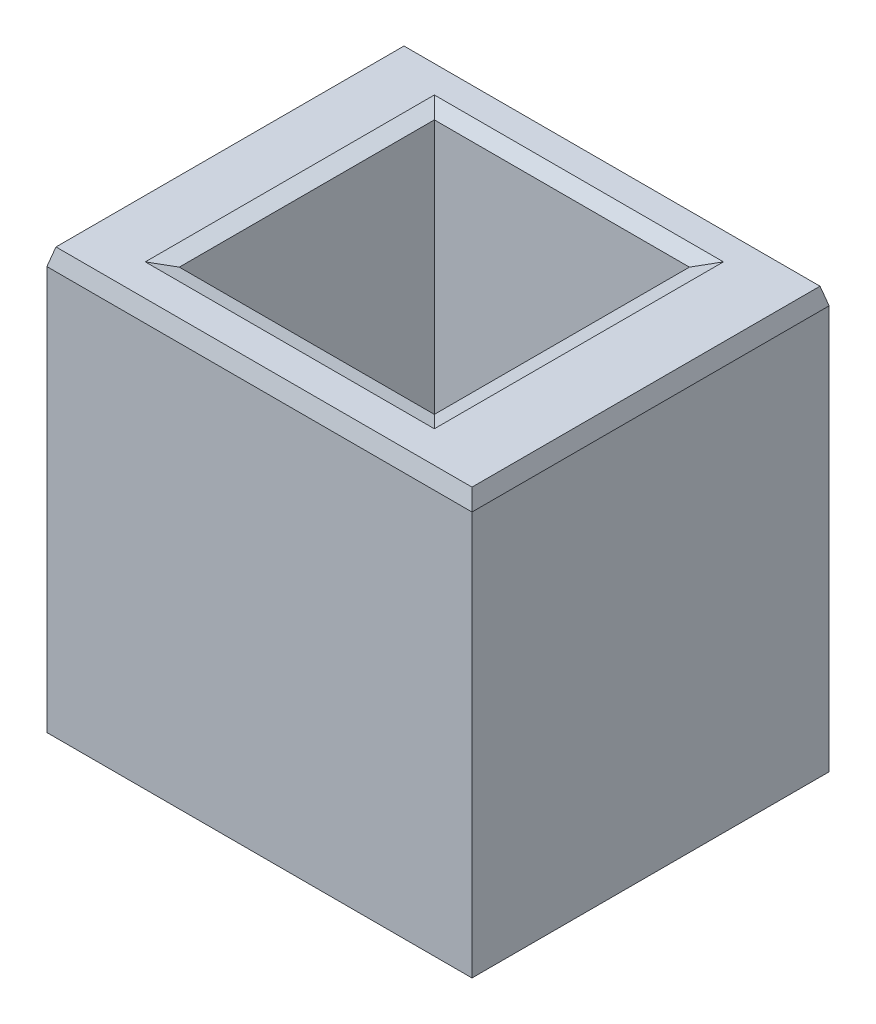
ISO-10303-21;
HEADER;
FILE_DESCRIPTION(('STEP AP214'),'2;1');
FILE_NAME('part.step','',(''),(''),'','','');
FILE_SCHEMA(('AUTOMOTIVE_DESIGN { 1 0 10303 214 1 1 1 1 }'));
ENDSEC;
DATA;
#1=APPLICATION_CONTEXT('core data for automotive mechanical design processes');
#2=APPLICATION_PROTOCOL_DEFINITION('international standard','automotive_design',2000,#1);
#3=PRODUCT_CONTEXT('',#1,'mechanical');
#4=PRODUCT('Part','Part','',(#3));
#5=PRODUCT_RELATED_PRODUCT_CATEGORY('part','',(#4));
#6=PRODUCT_DEFINITION_FORMATION('','',#4);
#7=PRODUCT_DEFINITION_CONTEXT('part definition',#1,'design');
#8=PRODUCT_DEFINITION('design','',#6,#7);
#9=PRODUCT_DEFINITION_SHAPE('','',#8);
#10=(LENGTH_UNIT() NAMED_UNIT(*) SI_UNIT(.MILLI.,.METRE.));
#11=(NAMED_UNIT(*) PLANE_ANGLE_UNIT() SI_UNIT($,.RADIAN.));
#12=(NAMED_UNIT(*) SI_UNIT($,.STERADIAN.) SOLID_ANGLE_UNIT());
#13=UNCERTAINTY_MEASURE_WITH_UNIT(LENGTH_MEASURE(1.E-05),#10,'distance_accuracy_value','');
#14=(GEOMETRIC_REPRESENTATION_CONTEXT(3) GLOBAL_UNCERTAINTY_ASSIGNED_CONTEXT((#13)) GLOBAL_UNIT_ASSIGNED_CONTEXT((#10,
#11,#12)) REPRESENTATION_CONTEXT('',''));
#15=CARTESIAN_POINT('',(0.,0.,0.));
#16=DIRECTION('',(0.,0.,1.));
#17=DIRECTION('',(1.,0.,0.));
#18=AXIS2_PLACEMENT_3D('',#15,#16,#17);
#19=CARTESIAN_POINT('',(0.,127.,0.));
#20=DIRECTION('',(0.,1.,0.));
#21=DIRECTION('',(0.,0.,1.));
#22=AXIS2_PLACEMENT_3D('',#19,#20,#21);
#23=PLANE('',#22);
#24=DIRECTION('',(-1.,0.,0.));
#25=VECTOR('',#24,1.);
#26=CARTESIAN_POINT('',(0.,127.,67.2868804878541));
#27=LINE('',#26,#25);
#28=CARTESIAN_POINT('',(46.7040091728361,127.,67.2868804878541));
#29=VERTEX_POINT('',#28);
#30=CARTESIAN_POINT('',(-39.6559908271641,127.,67.2868804878541));
#31=VERTEX_POINT('',#30);
#32=EDGE_CURVE('E48',#29,#31,#27,.T.);
#33=ORIENTED_EDGE('',*,*,#32,.T.);
#34=DIRECTION('',(0.,0.,-1.));
#35=VECTOR('',#34,1.);
#36=CARTESIAN_POINT('',(-39.6559908271641,127.,0.));
#37=LINE('',#36,#35);
#38=CARTESIAN_POINT('',(-39.6559908271641,127.,-19.073119512146));
#39=VERTEX_POINT('',#38);
#40=EDGE_CURVE('E11',#31,#39,#37,.T.);
#41=ORIENTED_EDGE('',*,*,#40,.T.);
#42=DIRECTION('',(1.,0.,0.));
#43=VECTOR('',#42,1.);
#44=CARTESIAN_POINT('',(0.,127.,-19.073119512146));
#45=LINE('',#44,#43);
#46=CARTESIAN_POINT('',(46.7040091728361,127.,-19.073119512146));
#47=VERTEX_POINT('',#46);
#48=EDGE_CURVE('E235',#39,#47,#45,.T.);
#49=ORIENTED_EDGE('',*,*,#48,.T.);
#50=DIRECTION('',(0.,0.,1.));
#51=VECTOR('',#50,1.);
#52=CARTESIAN_POINT('',(46.7040091728361,127.,0.));
#53=LINE('',#52,#51);
#54=EDGE_CURVE('E59',#47,#29,#53,.T.);
#55=ORIENTED_EDGE('',*,*,#54,.T.);
#56=EDGE_LOOP('',(#33,#41,#49,#55));
#57=FACE_BOUND('',#56,.T.);
#58=DIRECTION('',(0.,0.,-1.));
#59=VECTOR('',#58,1.);
#60=CARTESIAN_POINT('',(67.4192018977591,127.,-28.5682302771855));
#61=LINE('',#60,#59);
#62=CARTESIAN_POINT('',(67.4192018977591,127.,76.7614193817676));
#63=VERTEX_POINT('',#62);
#64=CARTESIAN_POINT('',(67.4192018977591,127.,-27.2070483796354));
#65=VERTEX_POINT('',#64);
#66=EDGE_CURVE('E230',#63,#65,#61,.T.);
#67=ORIENTED_EDGE('',*,*,#66,.T.);
#68=DIRECTION('',(-1.,0.,0.));
#69=VECTOR('',#68,1.);
#70=CARTESIAN_POINT('',(-58.2196162046908,127.,-27.2070483796354));
#71=LINE('',#70,#69);
#72=CARTESIAN_POINT('',(-56.8584343071407,127.,-27.2070483796354));
#73=VERTEX_POINT('',#72);
#74=EDGE_CURVE('E232',#65,#73,#71,.T.);
#75=ORIENTED_EDGE('',*,*,#74,.T.);
#76=DIRECTION('',(0.,0.,1.));
#77=VECTOR('',#76,1.);
#78=CARTESIAN_POINT('',(-56.8584343071407,127.,78.1226012793177));
#79=LINE('',#78,#77);
#80=CARTESIAN_POINT('',(-56.8584343071407,127.,76.7614193817676));
#81=VERTEX_POINT('',#80);
#82=EDGE_CURVE('E226',#73,#81,#79,.T.);
#83=ORIENTED_EDGE('',*,*,#82,.T.);
#84=DIRECTION('',(1.,0.,0.));
#85=VECTOR('',#84,1.);
#86=CARTESIAN_POINT('',(68.7803837953092,127.,76.7614193817676));
#87=LINE('',#86,#85);
#88=EDGE_CURVE('E228',#81,#63,#87,.T.);
#89=ORIENTED_EDGE('',*,*,#88,.T.);
#90=EDGE_LOOP('',(#67,#75,#83,#89));
#91=FACE_BOUND('',#90,.T.);
#92=ADVANCED_FACE('F38',(#57,#91),#23,.T.);
#93=CARTESIAN_POINT('',(0.,0.,0.));
#94=DIRECTION('',(0.,1.,0.));
#95=DIRECTION('',(0.,0.,1.));
#96=AXIS2_PLACEMENT_3D('',#93,#94,#95);
#97=PLANE('',#96);
#98=DIRECTION('',(0.,0.,1.));
#99=VECTOR('',#98,1.);
#100=CARTESIAN_POINT('',(-35.9371727247141,0.,62.2068804878541));
#101=LINE('',#100,#99);
#102=CARTESIAN_POINT('',(-35.9371727247141,0.,-15.3543014096961));
#103=VERTEX_POINT('',#102);
#104=CARTESIAN_POINT('',(-35.9371727247141,0.,63.5680623854042));
#105=VERTEX_POINT('',#104);
#106=EDGE_CURVE('E187',#103,#105,#101,.T.);
#107=ORIENTED_EDGE('',*,*,#106,.T.);
#108=DIRECTION('',(1.,0.,0.));
#109=VECTOR('',#108,1.);
#110=CARTESIAN_POINT('',(41.624009172836,0.,63.5680623854042));
#111=LINE('',#110,#109);
#112=CARTESIAN_POINT('',(42.9851910703861,0.,63.5680623854042));
#113=VERTEX_POINT('',#112);
#114=EDGE_CURVE('E189',#105,#113,#111,.T.);
#115=ORIENTED_EDGE('',*,*,#114,.T.);
#116=DIRECTION('',(0.,0.,-1.));
#117=VECTOR('',#116,1.);
#118=CARTESIAN_POINT('',(42.9851910703861,0.,-13.9931195121459));
#119=LINE('',#118,#117);
#120=CARTESIAN_POINT('',(42.9851910703861,0.,-15.3543014096961));
#121=VERTEX_POINT('',#120);
#122=EDGE_CURVE('E179',#113,#121,#119,.T.);
#123=ORIENTED_EDGE('',*,*,#122,.T.);
#124=DIRECTION('',(-1.,0.,0.));
#125=VECTOR('',#124,1.);
#126=CARTESIAN_POINT('',(-34.575990827164,0.,-15.3543014096961));
#127=LINE('',#126,#125);
#128=EDGE_CURVE('E181',#121,#103,#127,.T.);
#129=ORIENTED_EDGE('',*,*,#128,.T.);
#130=EDGE_LOOP('',(#107,#115,#123,#129));
#131=FACE_BOUND('',#130,.T.);
#132=DIRECTION('',(0.,0.,1.));
#133=VECTOR('',#132,1.);
#134=CARTESIAN_POINT('',(63.7003837953091,0.,0.));
#135=LINE('',#134,#133);
#136=CARTESIAN_POINT('',(63.7003837953091,0.,-23.4882302771854));
#137=VERTEX_POINT('',#136);
#138=CARTESIAN_POINT('',(63.7003837953091,0.,73.0426012793176));
#139=VERTEX_POINT('',#138);
#140=EDGE_CURVE('E178',#137,#139,#135,.T.);
#141=ORIENTED_EDGE('',*,*,#140,.T.);
#142=DIRECTION('',(-1.,0.,0.));
#143=VECTOR('',#142,1.);
#144=CARTESIAN_POINT('',(0.,0.,73.0426012793176));
#145=LINE('',#144,#143);
#146=CARTESIAN_POINT('',(-53.1396162046907,0.,73.0426012793176));
#147=VERTEX_POINT('',#146);
#148=EDGE_CURVE('E157',#139,#147,#145,.T.);
#149=ORIENTED_EDGE('',*,*,#148,.T.);
#150=DIRECTION('',(0.,0.,-1.));
#151=VECTOR('',#150,1.);
#152=CARTESIAN_POINT('',(-53.1396162046907,0.,0.));
#153=LINE('',#152,#151);
#154=CARTESIAN_POINT('',(-53.1396162046907,0.,-23.4882302771854));
#155=VERTEX_POINT('',#154);
#156=EDGE_CURVE('E167',#147,#155,#153,.T.);
#157=ORIENTED_EDGE('',*,*,#156,.T.);
#158=DIRECTION('',(1.,0.,0.));
#159=VECTOR('',#158,1.);
#160=CARTESIAN_POINT('',(0.,0.,-23.4882302771854));
#161=LINE('',#160,#159);
#162=EDGE_CURVE('E173',#155,#137,#161,.T.);
#163=ORIENTED_EDGE('',*,*,#162,.T.);
#164=EDGE_LOOP('',(#141,#149,#157,#163));
#165=FACE_BOUND('',#164,.T.);
#166=ADVANCED_FACE('F176',(#131,#165),#97,.F.);
#167=CARTESIAN_POINT('',(-58.2196162046908,127.,-28.5682302771855));
#168=DIRECTION('',(1.,0.,0.));
#169=DIRECTION('',(0.,0.,-1.));
#170=AXIS2_PLACEMENT_3D('',#167,#168,#169);
#171=PLANE('',#170);
#172=DIRECTION('',(0.,-1.,0.));
#173=VECTOR('',#172,1.);
#174=CARTESIAN_POINT('',(-58.2196162046908,127.,-28.5682302771855));
#175=LINE('',#174,#173);
#176=CARTESIAN_POINT('',(-58.2196162046908,121.92,-28.5682302771855));
#177=VERTEX_POINT('',#176);
#178=CARTESIAN_POINT('',(-58.2196162046908,1.36118189755011,-28.5682302771855));
#179=VERTEX_POINT('',#178);
#180=EDGE_CURVE('E310',#177,#179,#175,.T.);
#181=ORIENTED_EDGE('',*,*,#180,.T.);
#182=DIRECTION('',(0.,0.,1.));
#183=VECTOR('',#182,1.);
#184=CARTESIAN_POINT('',(-58.2196162046908,1.36118189755011,-28.5682302771855));
#185=LINE('',#184,#183);
#186=CARTESIAN_POINT('',(-58.2196162046908,1.36118189755011,78.1226012793177));
#187=VERTEX_POINT('',#186);
#188=EDGE_CURVE('E224',#179,#187,#185,.T.);
#189=ORIENTED_EDGE('',*,*,#188,.T.);
#190=DIRECTION('',(0.,-1.,0.));
#191=VECTOR('',#190,1.);
#192=CARTESIAN_POINT('',(-58.2196162046908,127.,78.1226012793177));
#193=LINE('',#192,#191);
#194=CARTESIAN_POINT('',(-58.2196162046908,121.92,78.1226012793177));
#195=VERTEX_POINT('',#194);
#196=EDGE_CURVE('E174',#195,#187,#193,.T.);
#197=ORIENTED_EDGE('',*,*,#196,.F.);
#198=DIRECTION('',(0.,0.,-1.));
#199=VECTOR('',#198,1.);
#200=CARTESIAN_POINT('',(-58.2196162046908,121.92,-28.5682302771855));
#201=LINE('',#200,#199);
#202=EDGE_CURVE('E222',#195,#177,#201,.T.);
#203=ORIENTED_EDGE('',*,*,#202,.T.);
#204=EDGE_LOOP('',(#181,#189,#197,#203));
#205=FACE_BOUND('',#204,.T.);
#206=ADVANCED_FACE('F292',(#205),#171,.F.);
#207=CARTESIAN_POINT('',(-58.2196162046908,127.,78.1226012793177));
#208=DIRECTION('',(0.,0.,-1.));
#209=DIRECTION('',(-1.,0.,0.));
#210=AXIS2_PLACEMENT_3D('',#207,#208,#209);
#211=PLANE('',#210);
#212=ORIENTED_EDGE('',*,*,#196,.T.);
#213=DIRECTION('',(1.,0.,0.));
#214=VECTOR('',#213,1.);
#215=CARTESIAN_POINT('',(-58.2196162046908,1.36118189755011,78.1226012793177));
#216=LINE('',#215,#214);
#217=CARTESIAN_POINT('',(68.7803837953092,1.36118189755011,78.1226012793177));
#218=VERTEX_POINT('',#217);
#219=EDGE_CURVE('E160',#187,#218,#216,.T.);
#220=ORIENTED_EDGE('',*,*,#219,.T.);
#221=DIRECTION('',(0.,-1.,0.));
#222=VECTOR('',#221,1.);
#223=CARTESIAN_POINT('',(68.7803837953092,127.,78.1226012793177));
#224=LINE('',#223,#222);
#225=CARTESIAN_POINT('',(68.7803837953092,121.92,78.1226012793177));
#226=VERTEX_POINT('',#225);
#227=EDGE_CURVE('E289',#226,#218,#224,.T.);
#228=ORIENTED_EDGE('',*,*,#227,.F.);
#229=DIRECTION('',(-1.,0.,0.));
#230=VECTOR('',#229,1.);
#231=CARTESIAN_POINT('',(-58.2196162046908,121.92,78.1226012793177));
#232=LINE('',#231,#230);
#233=EDGE_CURVE('E210',#226,#195,#232,.T.);
#234=ORIENTED_EDGE('',*,*,#233,.T.);
#235=EDGE_LOOP('',(#212,#220,#228,#234));
#236=FACE_BOUND('',#235,.T.);
#237=ADVANCED_FACE('F287',(#236),#211,.F.);
#238=CARTESIAN_POINT('',(68.7803837953092,127.,-28.5682302771855));
#239=DIRECTION('',(-1.,0.,0.));
#240=DIRECTION('',(0.,0.,1.));
#241=AXIS2_PLACEMENT_3D('',#238,#239,#240);
#242=PLANE('',#241);
#243=ORIENTED_EDGE('',*,*,#227,.T.);
#244=DIRECTION('',(0.,0.,-1.));
#245=VECTOR('',#244,1.);
#246=CARTESIAN_POINT('',(68.7803837953092,1.36118189755011,-28.5682302771855));
#247=LINE('',#246,#245);
#248=CARTESIAN_POINT('',(68.7803837953092,1.36118189755011,-28.5682302771855));
#249=VERTEX_POINT('',#248);
#250=EDGE_CURVE('E215',#218,#249,#247,.T.);
#251=ORIENTED_EDGE('',*,*,#250,.T.);
#252=DIRECTION('',(0.,-1.,0.));
#253=VECTOR('',#252,1.);
#254=CARTESIAN_POINT('',(68.7803837953092,127.,-28.5682302771855));
#255=LINE('',#254,#253);
#256=CARTESIAN_POINT('',(68.7803837953092,121.92,-28.5682302771855));
#257=VERTEX_POINT('',#256);
#258=EDGE_CURVE('E295',#257,#249,#255,.T.);
#259=ORIENTED_EDGE('',*,*,#258,.F.);
#260=DIRECTION('',(0.,0.,1.));
#261=VECTOR('',#260,1.);
#262=CARTESIAN_POINT('',(68.7803837953092,121.92,78.1226012793177));
#263=LINE('',#262,#261);
#264=EDGE_CURVE('E213',#257,#226,#263,.T.);
#265=ORIENTED_EDGE('',*,*,#264,.T.);
#266=EDGE_LOOP('',(#243,#251,#259,#265));
#267=FACE_BOUND('',#266,.T.);
#268=ADVANCED_FACE('F308',(#267),#242,.F.);
#269=CARTESIAN_POINT('',(-58.2196162046908,127.,-28.5682302771855));
#270=DIRECTION('',(0.,0.,1.));
#271=DIRECTION('',(1.,0.,0.));
#272=AXIS2_PLACEMENT_3D('',#269,#270,#271);
#273=PLANE('',#272);
#274=ORIENTED_EDGE('',*,*,#258,.T.);
#275=DIRECTION('',(-1.,0.,0.));
#276=VECTOR('',#275,1.);
#277=CARTESIAN_POINT('',(-58.2196162046908,1.36118189755011,-28.5682302771855));
#278=LINE('',#277,#276);
#279=EDGE_CURVE('E220',#249,#179,#278,.T.);
#280=ORIENTED_EDGE('',*,*,#279,.T.);
#281=ORIENTED_EDGE('',*,*,#180,.F.);
#282=DIRECTION('',(1.,0.,0.));
#283=VECTOR('',#282,1.);
#284=CARTESIAN_POINT('',(68.7803837953092,121.92,-28.5682302771855));
#285=LINE('',#284,#283);
#286=EDGE_CURVE('E217',#177,#257,#285,.T.);
#287=ORIENTED_EDGE('',*,*,#286,.T.);
#288=EDGE_LOOP('',(#274,#280,#281,#287));
#289=FACE_BOUND('',#288,.T.);
#290=ADVANCED_FACE('F380',(#289),#273,.F.);
#291=CARTESIAN_POINT('',(41.624009172836,127.,-13.9931195121459));
#292=DIRECTION('',(-1.,0.,0.));
#293=DIRECTION('',(0.,0.,1.));
#294=AXIS2_PLACEMENT_3D('',#291,#292,#293);
#295=PLANE('',#294);
#296=DIRECTION('',(0.,-1.,0.));
#297=VECTOR('',#296,1.);
#298=CARTESIAN_POINT('',(41.624009172836,127.,-13.9931195121459));
#299=LINE('',#298,#297);
#300=CARTESIAN_POINT('',(41.624009172836,125.63881810245,-13.9931195121459));
#301=VERTEX_POINT('',#300);
#302=CARTESIAN_POINT('',(41.624009172836,5.08000000000008,-13.9931195121459));
#303=VERTEX_POINT('',#302);
#304=EDGE_CURVE('E311',#301,#303,#299,.T.);
#305=ORIENTED_EDGE('',*,*,#304,.T.);
#306=DIRECTION('',(0.,0.,1.));
#307=VECTOR('',#306,1.);
#308=CARTESIAN_POINT('',(41.624009172836,5.08000000000008,62.2068804878541));
#309=LINE('',#308,#307);
#310=CARTESIAN_POINT('',(41.624009172836,5.08000000000008,62.2068804878541));
#311=VERTEX_POINT('',#310);
#312=EDGE_CURVE('E208',#303,#311,#309,.T.);
#313=ORIENTED_EDGE('',*,*,#312,.T.);
#314=DIRECTION('',(0.,-1.,0.));
#315=VECTOR('',#314,1.);
#316=CARTESIAN_POINT('',(41.624009172836,127.,62.2068804878541));
#317=LINE('',#316,#315);
#318=CARTESIAN_POINT('',(41.624009172836,125.63881810245,62.2068804878541));
#319=VERTEX_POINT('',#318);
#320=EDGE_CURVE('E249',#319,#311,#317,.T.);
#321=ORIENTED_EDGE('',*,*,#320,.F.);
#322=DIRECTION('',(0.,0.,-1.));
#323=VECTOR('',#322,1.);
#324=CARTESIAN_POINT('',(41.624009172836,125.63881810245,-13.9931195121459));
#325=LINE('',#324,#323);
#326=EDGE_CURVE('E206',#319,#301,#325,.T.);
#327=ORIENTED_EDGE('',*,*,#326,.T.);
#328=EDGE_LOOP('',(#305,#313,#321,#327));
#329=FACE_BOUND('',#328,.T.);
#330=ADVANCED_FACE('F377',(#329),#295,.T.);
#331=CARTESIAN_POINT('',(-34.575990827164,127.,-13.9931195121459));
#332=DIRECTION('',(0.,0.,1.));
#333=DIRECTION('',(1.,0.,0.));
#334=AXIS2_PLACEMENT_3D('',#331,#332,#333);
#335=PLANE('',#334);
#336=DIRECTION('',(0.,-1.,0.));
#337=VECTOR('',#336,1.);
#338=CARTESIAN_POINT('',(-34.575990827164,127.,-13.9931195121459));
#339=LINE('',#338,#337);
#340=CARTESIAN_POINT('',(-34.575990827164,125.63881810245,-13.9931195121459));
#341=VERTEX_POINT('',#340);
#342=CARTESIAN_POINT('',(-34.575990827164,5.08000000000008,-13.9931195121459));
#343=VERTEX_POINT('',#342);
#344=EDGE_CURVE('E316',#341,#343,#339,.T.);
#345=ORIENTED_EDGE('',*,*,#344,.T.);
#346=DIRECTION('',(1.,0.,0.));
#347=VECTOR('',#346,1.);
#348=CARTESIAN_POINT('',(41.624009172836,5.08000000000008,-13.9931195121459));
#349=LINE('',#348,#347);
#350=EDGE_CURVE('E204',#343,#303,#349,.T.);
#351=ORIENTED_EDGE('',*,*,#350,.T.);
#352=ORIENTED_EDGE('',*,*,#304,.F.);
#353=DIRECTION('',(-1.,0.,0.));
#354=VECTOR('',#353,1.);
#355=CARTESIAN_POINT('',(-34.575990827164,125.63881810245,-13.9931195121459));
#356=LINE('',#355,#354);
#357=EDGE_CURVE('E202',#301,#341,#356,.T.);
#358=ORIENTED_EDGE('',*,*,#357,.T.);
#359=EDGE_LOOP('',(#345,#351,#352,#358));
#360=FACE_BOUND('',#359,.T.);
#361=ADVANCED_FACE('F354',(#360),#335,.T.);
#362=CARTESIAN_POINT('',(-34.575990827164,127.,-13.9931195121459));
#363=DIRECTION('',(1.,0.,0.));
#364=DIRECTION('',(0.,0.,-1.));
#365=AXIS2_PLACEMENT_3D('',#362,#363,#364);
#366=PLANE('',#365);
#367=DIRECTION('',(0.,-1.,0.));
#368=VECTOR('',#367,1.);
#369=CARTESIAN_POINT('',(-34.575990827164,127.,62.2068804878541));
#370=LINE('',#369,#368);
#371=CARTESIAN_POINT('',(-34.575990827164,125.63881810245,62.2068804878541));
#372=VERTEX_POINT('',#371);
#373=CARTESIAN_POINT('',(-34.575990827164,5.08000000000008,62.2068804878541));
#374=VERTEX_POINT('',#373);
#375=EDGE_CURVE('E319',#372,#374,#370,.T.);
#376=ORIENTED_EDGE('',*,*,#375,.T.);
#377=DIRECTION('',(0.,0.,-1.));
#378=VECTOR('',#377,1.);
#379=CARTESIAN_POINT('',(-34.575990827164,5.08000000000008,-13.9931195121459));
#380=LINE('',#379,#378);
#381=EDGE_CURVE('E200',#374,#343,#380,.T.);
#382=ORIENTED_EDGE('',*,*,#381,.T.);
#383=ORIENTED_EDGE('',*,*,#344,.F.);
#384=DIRECTION('',(0.,0.,1.));
#385=VECTOR('',#384,1.);
#386=CARTESIAN_POINT('',(-34.575990827164,125.63881810245,-13.9931195121459));
#387=LINE('',#386,#385);
#388=EDGE_CURVE('E197',#341,#372,#387,.T.);
#389=ORIENTED_EDGE('',*,*,#388,.T.);
#390=EDGE_LOOP('',(#376,#382,#383,#389));
#391=FACE_BOUND('',#390,.T.);
#392=ADVANCED_FACE('F350',(#391),#366,.T.);
#393=CARTESIAN_POINT('',(-34.575990827164,127.,62.2068804878541));
#394=DIRECTION('',(0.,0.,-1.));
#395=DIRECTION('',(-1.,0.,0.));
#396=AXIS2_PLACEMENT_3D('',#393,#394,#395);
#397=PLANE('',#396);
#398=ORIENTED_EDGE('',*,*,#320,.T.);
#399=DIRECTION('',(-1.,0.,0.));
#400=VECTOR('',#399,1.);
#401=CARTESIAN_POINT('',(-34.575990827164,5.08000000000008,62.2068804878541));
#402=LINE('',#401,#400);
#403=EDGE_CURVE('E194',#311,#374,#402,.T.);
#404=ORIENTED_EDGE('',*,*,#403,.T.);
#405=ORIENTED_EDGE('',*,*,#375,.F.);
#406=DIRECTION('',(1.,0.,0.));
#407=VECTOR('',#406,1.);
#408=CARTESIAN_POINT('',(-34.575990827164,125.63881810245,62.2068804878541));
#409=LINE('',#408,#407);
#410=EDGE_CURVE('E192',#372,#319,#409,.T.);
#411=ORIENTED_EDGE('',*,*,#410,.T.);
#412=EDGE_LOOP('',(#398,#404,#405,#411));
#413=FACE_BOUND('',#412,.T.);
#414=ADVANCED_FACE('F326',(#413),#397,.T.);
#415=CARTESIAN_POINT('',(0.,0.,-15.3543014096961));
#416=DIRECTION('',(0.,-0.258819045102517,0.965925826289069));
#417=DIRECTION('',(1.,0.,0.));
#418=AXIS2_PLACEMENT_3D('',#415,#416,#417);
#419=PLANE('',#418);
#420=DIRECTION('',(0.250562807085728,-0.935113126531031,-0.250562807085728));
#421=VECTOR('',#420,1.);
#422=CARTESIAN_POINT('',(40.2865068277918,10.0716267069478,-12.6556171671017));
#423=LINE('',#422,#421);
#424=EDGE_CURVE('E243',#303,#121,#423,.T.);
#425=ORIENTED_EDGE('',*,*,#424,.F.);
#426=ORIENTED_EDGE('',*,*,#350,.F.);
#427=DIRECTION('',(-0.250562807085728,-0.935113126531031,-0.250562807085729));
#428=VECTOR('',#427,1.);
#429=CARTESIAN_POINT('',(-34.9732032682903,3.59758298831804,-14.3903319532723));
#430=LINE('',#429,#428);
#431=EDGE_CURVE('E246',#103,#343,#430,.F.);
#432=ORIENTED_EDGE('',*,*,#431,.F.);
#433=ORIENTED_EDGE('',*,*,#128,.F.);
#434=EDGE_LOOP('',(#425,#426,#432,#433));
#435=FACE_BOUND('',#434,.T.);
#436=ADVANCED_FACE('F358',(#435),#419,.T.);
#437=CARTESIAN_POINT('',(-35.9371727247141,0.,0.));
#438=DIRECTION('',(0.96592582628907,-0.258819045102516,0.));
#439=DIRECTION('',(0.,0.,-1.));
#440=AXIS2_PLACEMENT_3D('',#437,#438,#439);
#441=PLANE('',#440);
#442=ORIENTED_EDGE('',*,*,#431,.T.);
#443=ORIENTED_EDGE('',*,*,#381,.F.);
#444=DIRECTION('',(-0.250562807085727,-0.935113126531031,0.250562807085729));
#445=VECTOR('',#444,1.);
#446=CARTESIAN_POINT('',(-33.6809751985295,8.42024379963224,61.3118648592196));
#447=LINE('',#446,#445);
#448=EDGE_CURVE('E241',#105,#374,#447,.F.);
#449=ORIENTED_EDGE('',*,*,#448,.F.);
#450=ORIENTED_EDGE('',*,*,#106,.F.);
#451=EDGE_LOOP('',(#442,#443,#449,#450));
#452=FACE_BOUND('',#451,.T.);
#453=ADVANCED_FACE('F347',(#452),#441,.T.);
#454=CARTESIAN_POINT('',(42.9851910703861,0.,0.));
#455=DIRECTION('',(-0.965925826289069,-0.258819045102517,0.));
#456=DIRECTION('',(0.,0.,1.));
#457=AXIS2_PLACEMENT_3D('',#454,#455,#456);
#458=PLANE('',#457);
#459=ORIENTED_EDGE('',*,*,#424,.T.);
#460=ORIENTED_EDGE('',*,*,#122,.F.);
#461=DIRECTION('',(-0.250562807085728,0.935113126531031,-0.250562807085728));
#462=VECTOR('',#461,1.);
#463=CARTESIAN_POINT('',(40.2865068277918,10.0716267069478,60.8693781428098));
#464=LINE('',#463,#462);
#465=EDGE_CURVE('E239',#311,#113,#464,.F.);
#466=ORIENTED_EDGE('',*,*,#465,.F.);
#467=ORIENTED_EDGE('',*,*,#312,.F.);
#468=EDGE_LOOP('',(#459,#460,#466,#467));
#469=FACE_BOUND('',#468,.T.);
#470=ADVANCED_FACE('F340',(#469),#458,.T.);
#471=CARTESIAN_POINT('',(0.,0.,63.5680623854042));
#472=DIRECTION('',(0.,-0.258819045102517,-0.965925826289069));
#473=DIRECTION('',(-1.,0.,0.));
#474=AXIS2_PLACEMENT_3D('',#471,#472,#473);
#475=PLANE('',#474);
#476=ORIENTED_EDGE('',*,*,#448,.T.);
#477=ORIENTED_EDGE('',*,*,#403,.F.);
#478=ORIENTED_EDGE('',*,*,#465,.T.);
#479=ORIENTED_EDGE('',*,*,#114,.F.);
#480=EDGE_LOOP('',(#476,#477,#478,#479));
#481=FACE_BOUND('',#480,.T.);
#482=ADVANCED_FACE('F333',(#481),#475,.T.);
#483=CARTESIAN_POINT('',(-58.2196162046908,1.36118189755011,-28.5682302771855));
#484=DIRECTION('',(0.,0.965925826289069,0.258819045102517));
#485=DIRECTION('',(-1.,0.,0.));
#486=AXIS2_PLACEMENT_3D('',#483,#484,#485);
#487=PLANE('',#486);
#488=DIRECTION('',(-0.694746590606866,-0.186156787897383,0.694746590606866));
#489=VECTOR('',#488,1.);
#490=CARTESIAN_POINT('',(7.48093500000641,-15.063955903624,32.7312185181173));
#491=LINE('',#490,#489);
#492=EDGE_CURVE('E163',#137,#249,#491,.F.);
#493=ORIENTED_EDGE('',*,*,#492,.F.);
#494=ORIENTED_EDGE('',*,*,#162,.F.);
#495=DIRECTION('',(0.694746590606866,-0.186156787897383,0.694746590606866));
#496=VECTOR('',#495,1.);
#497=CARTESIAN_POINT('',(-58.2196162046908,1.36118189755011,-28.5682302771855));
#498=LINE('',#497,#496);
#499=EDGE_CURVE('E170',#179,#155,#498,.T.);
#500=ORIENTED_EDGE('',*,*,#499,.F.);
#501=ORIENTED_EDGE('',*,*,#279,.F.);
#502=EDGE_LOOP('',(#493,#494,#500,#501));
#503=FACE_BOUND('',#502,.T.);
#504=ADVANCED_FACE('F301',(#503),#487,.F.);
#505=CARTESIAN_POINT('',(-58.2196162046908,1.36118189755011,-28.5682302771855));
#506=DIRECTION('',(0.258819045102517,0.965925826289069,0.));
#507=DIRECTION('',(0.,0.,1.));
#508=AXIS2_PLACEMENT_3D('',#505,#506,#507);
#509=PLANE('',#508);
#510=ORIENTED_EDGE('',*,*,#499,.T.);
#511=ORIENTED_EDGE('',*,*,#156,.F.);
#512=DIRECTION('',(-0.694746590606866,0.186156787897383,0.694746590606866));
#513=VECTOR('',#512,1.);
#514=CARTESIAN_POINT('',(-6.72285111865822,-12.4373347200674,26.6258361932851));
#515=LINE('',#514,#513);
#516=EDGE_CURVE('E153',#187,#147,#515,.F.);
#517=ORIENTED_EDGE('',*,*,#516,.F.);
#518=ORIENTED_EDGE('',*,*,#188,.F.);
#519=EDGE_LOOP('',(#510,#511,#517,#518));
#520=FACE_BOUND('',#519,.T.);
#521=ADVANCED_FACE('F168',(#520),#509,.F.);
#522=CARTESIAN_POINT('',(68.7803837953092,1.36118189755011,-28.5682302771855));
#523=DIRECTION('',(-0.258819045102517,0.965925826289069,0.));
#524=DIRECTION('',(0.,0.,-1.));
#525=AXIS2_PLACEMENT_3D('',#522,#523,#524);
#526=PLANE('',#525);
#527=ORIENTED_EDGE('',*,*,#492,.T.);
#528=ORIENTED_EDGE('',*,*,#250,.F.);
#529=DIRECTION('',(-0.694746590606866,-0.186156787897383,-0.694746590606866));
#530=VECTOR('',#529,1.);
#531=CARTESIAN_POINT('',(17.2836187092766,-12.4373347200674,26.6258361932851));
#532=LINE('',#531,#530);
#533=EDGE_CURVE('E164',#139,#218,#532,.F.);
#534=ORIENTED_EDGE('',*,*,#533,.F.);
#535=ORIENTED_EDGE('',*,*,#140,.F.);
#536=EDGE_LOOP('',(#527,#528,#534,#535));
#537=FACE_BOUND('',#536,.T.);
#538=ADVANCED_FACE('F304',(#537),#526,.F.);
#539=CARTESIAN_POINT('',(-58.2196162046908,1.36118189755011,78.1226012793177));
#540=DIRECTION('',(0.,0.965925826289069,-0.258819045102517));
#541=DIRECTION('',(1.,0.,0.));
#542=AXIS2_PLACEMENT_3D('',#539,#540,#541);
#543=PLANE('',#542);
#544=ORIENTED_EDGE('',*,*,#516,.T.);
#545=ORIENTED_EDGE('',*,*,#148,.F.);
#546=ORIENTED_EDGE('',*,*,#533,.T.);
#547=ORIENTED_EDGE('',*,*,#219,.F.);
#548=EDGE_LOOP('',(#544,#545,#546,#547));
#549=FACE_BOUND('',#548,.T.);
#550=ADVANCED_FACE('F155',(#549),#543,.F.);
#551=CARTESIAN_POINT('',(41.624009172836,125.63881810245,-13.9931195121459));
#552=DIRECTION('',(0.258819045102517,-0.965925826289069,0.));
#553=DIRECTION('',(0.,0.,-1.));
#554=AXIS2_PLACEMENT_3D('',#551,#552,#553);
#555=PLANE('',#554);
#556=DIRECTION('',(0.694746590606866,0.186156787897383,0.694746590606866));
#557=VECTOR('',#556,1.);
#558=CARTESIAN_POINT('',(4.84433989565436,115.783735421745,25.4272112106724));
#559=LINE('',#558,#557);
#560=EDGE_CURVE('E259',#29,#319,#559,.F.);
#561=ORIENTED_EDGE('',*,*,#560,.F.);
#562=ORIENTED_EDGE('',*,*,#54,.F.);
#563=DIRECTION('',(0.694746590606866,0.186156787897383,-0.694746590606866));
#564=VECTOR('',#563,1.);
#565=CARTESIAN_POINT('',(41.624009172836,125.63881810245,-13.9931195121459));
#566=LINE('',#565,#564);
#567=EDGE_CURVE('E250',#301,#47,#566,.T.);
#568=ORIENTED_EDGE('',*,*,#567,.F.);
#569=ORIENTED_EDGE('',*,*,#326,.F.);
#570=EDGE_LOOP('',(#561,#562,#568,#569));
#571=FACE_BOUND('',#570,.T.);
#572=ADVANCED_FACE('F436',(#571),#555,.F.);
#573=CARTESIAN_POINT('',(-34.575990827164,125.63881810245,-13.9931195121459));
#574=DIRECTION('',(0.,-0.965925826289069,-0.258819045102517));
#575=DIRECTION('',(-1.,0.,0.));
#576=AXIS2_PLACEMENT_3D('',#573,#574,#575);
#577=PLANE('',#576);
#578=ORIENTED_EDGE('',*,*,#567,.T.);
#579=ORIENTED_EDGE('',*,*,#48,.F.);
#580=DIRECTION('',(0.694746590606866,-0.186156787897383,0.694746590606866));
#581=VECTOR('',#580,1.);
#582=CARTESIAN_POINT('',(-34.575990827164,125.63881810245,-13.9931195121459));
#583=LINE('',#582,#581);
#584=EDGE_CURVE('E257',#341,#39,#583,.F.);
#585=ORIENTED_EDGE('',*,*,#584,.F.);
#586=ORIENTED_EDGE('',*,*,#357,.F.);
#587=EDGE_LOOP('',(#578,#579,#585,#586));
#588=FACE_BOUND('',#587,.T.);
#589=ADVANCED_FACE('F442',(#588),#577,.F.);
#590=CARTESIAN_POINT('',(-34.575990827164,125.63881810245,62.2068804878541));
#591=DIRECTION('',(0.,-0.965925826289069,0.258819045102517));
#592=DIRECTION('',(1.,0.,0.));
#593=AXIS2_PLACEMENT_3D('',#590,#591,#592);
#594=PLANE('',#593);
#595=ORIENTED_EDGE('',*,*,#560,.T.);
#596=ORIENTED_EDGE('',*,*,#410,.F.);
#597=DIRECTION('',(-0.694746590606866,0.186156787897383,0.694746590606867));
#598=VECTOR('',#597,1.);
#599=CARTESIAN_POINT('',(2.2036784500177,115.783735421745,25.4272112106723));
#600=LINE('',#599,#598);
#601=EDGE_CURVE('E255',#31,#372,#600,.F.);
#602=ORIENTED_EDGE('',*,*,#601,.F.);
#603=ORIENTED_EDGE('',*,*,#32,.F.);
#604=EDGE_LOOP('',(#595,#596,#602,#603));
#605=FACE_BOUND('',#604,.T.);
#606=ADVANCED_FACE('F450',(#605),#594,.F.);
#607=CARTESIAN_POINT('',(-34.575990827164,125.63881810245,-13.9931195121459));
#608=DIRECTION('',(-0.258819045102518,-0.965925826289069,0.));
#609=DIRECTION('',(0.,0.,1.));
#610=AXIS2_PLACEMENT_3D('',#607,#608,#609);
#611=PLANE('',#610);
#612=ORIENTED_EDGE('',*,*,#584,.T.);
#613=ORIENTED_EDGE('',*,*,#40,.F.);
#614=ORIENTED_EDGE('',*,*,#601,.T.);
#615=ORIENTED_EDGE('',*,*,#388,.F.);
#616=EDGE_LOOP('',(#612,#613,#614,#615));
#617=FACE_BOUND('',#616,.T.);
#618=ADVANCED_FACE('F458',(#617),#611,.F.);
#619=CARTESIAN_POINT('',(0.,127.,76.7614193817676));
#620=DIRECTION('',(0.,0.258819045102517,0.965925826289069));
#621=DIRECTION('',(-1.,0.,0.));
#622=AXIS2_PLACEMENT_3D('',#619,#620,#621);
#623=PLANE('',#622);
#624=DIRECTION('',(0.250562807085728,0.935113126531031,-0.250562807085728));
#625=VECTOR('',#624,1.);
#626=CARTESIAN_POINT('',(-52.0392203460919,144.985551355179,71.9422054207188));
#627=LINE('',#626,#625);
#628=EDGE_CURVE('E267',#195,#81,#627,.T.);
#629=ORIENTED_EDGE('',*,*,#628,.F.);
#630=ORIENTED_EDGE('',*,*,#233,.F.);
#631=DIRECTION('',(-0.250562807085728,0.935113126531031,-0.250562807085728));
#632=VECTOR('',#631,1.);
#633=CARTESIAN_POINT('',(63.1865084217234,142.796627105431,72.5287259057319));
#634=LINE('',#633,#632);
#635=EDGE_CURVE('E43',#63,#226,#634,.F.);
#636=ORIENTED_EDGE('',*,*,#635,.F.);
#637=ORIENTED_EDGE('',*,*,#88,.F.);
#638=EDGE_LOOP('',(#629,#630,#636,#637));
#639=FACE_BOUND('',#638,.T.);
#640=ADVANCED_FACE('F41',(#639),#623,.T.);
#641=CARTESIAN_POINT('',(67.4192018977591,127.,0.));
#642=DIRECTION('',(0.965925826289069,0.258819045102517,0.));
#643=DIRECTION('',(0.,0.,1.));
#644=AXIS2_PLACEMENT_3D('',#641,#642,#643);
#645=PLANE('',#644);
#646=ORIENTED_EDGE('',*,*,#635,.T.);
#647=ORIENTED_EDGE('',*,*,#264,.F.);
#648=DIRECTION('',(-0.250562807085728,0.935113126531031,0.250562807085728));
#649=VECTOR('',#648,1.);
#650=CARTESIAN_POINT('',(65.711096596345,133.374735769555,-25.4989430782213));
#651=LINE('',#650,#649);
#652=EDGE_CURVE('E266',#65,#257,#651,.F.);
#653=ORIENTED_EDGE('',*,*,#652,.F.);
#654=ORIENTED_EDGE('',*,*,#66,.F.);
#655=EDGE_LOOP('',(#646,#647,#653,#654));
#656=FACE_BOUND('',#655,.T.);
#657=ADVANCED_FACE('F278',(#656),#645,.T.);
#658=CARTESIAN_POINT('',(-56.8584343071407,127.,0.));
#659=DIRECTION('',(-0.965925826289069,0.258819045102517,0.));
#660=DIRECTION('',(0.,0.,-1.));
#661=AXIS2_PLACEMENT_3D('',#658,#659,#660);
#662=PLANE('',#661);
#663=ORIENTED_EDGE('',*,*,#628,.T.);
#664=ORIENTED_EDGE('',*,*,#82,.F.);
#665=DIRECTION('',(-0.250562807085728,-0.935113126531031,-0.250562807085728));
#666=VECTOR('',#665,1.);
#667=CARTESIAN_POINT('',(-55.1503290057266,133.374735769555,-25.4989430782213));
#668=LINE('',#667,#666);
#669=EDGE_CURVE('E264',#177,#73,#668,.F.);
#670=ORIENTED_EDGE('',*,*,#669,.F.);
#671=ORIENTED_EDGE('',*,*,#202,.F.);
#672=EDGE_LOOP('',(#663,#664,#670,#671));
#673=FACE_BOUND('',#672,.T.);
#674=ADVANCED_FACE('F478',(#673),#662,.T.);
#675=CARTESIAN_POINT('',(0.,127.,-27.2070483796354));
#676=DIRECTION('',(0.,0.258819045102517,-0.965925826289069));
#677=DIRECTION('',(1.,0.,0.));
#678=AXIS2_PLACEMENT_3D('',#675,#676,#677);
#679=PLANE('',#678);
#680=ORIENTED_EDGE('',*,*,#652,.T.);
#681=ORIENTED_EDGE('',*,*,#286,.F.);
#682=ORIENTED_EDGE('',*,*,#669,.T.);
#683=ORIENTED_EDGE('',*,*,#74,.F.);
#684=EDGE_LOOP('',(#680,#681,#682,#683));
#685=FACE_BOUND('',#684,.T.);
#686=ADVANCED_FACE('F484',(#685),#679,.T.);
#687=CLOSED_SHELL('',(#92,#166,#206,#237,#268,#290,#330,#361,#392,#414,#436,#453,#470,#482,#504,
#521,#538,#550,#572,#589,#606,#618,#640,#657,#674,#686));
#688=MANIFOLD_SOLID_BREP('B2',#687);
#689=ADVANCED_BREP_SHAPE_REPRESENTATION('',(#18,#688),#14);
#690=SHAPE_DEFINITION_REPRESENTATION(#9,#689);
ENDSEC;
END-ISO-10303-21;
